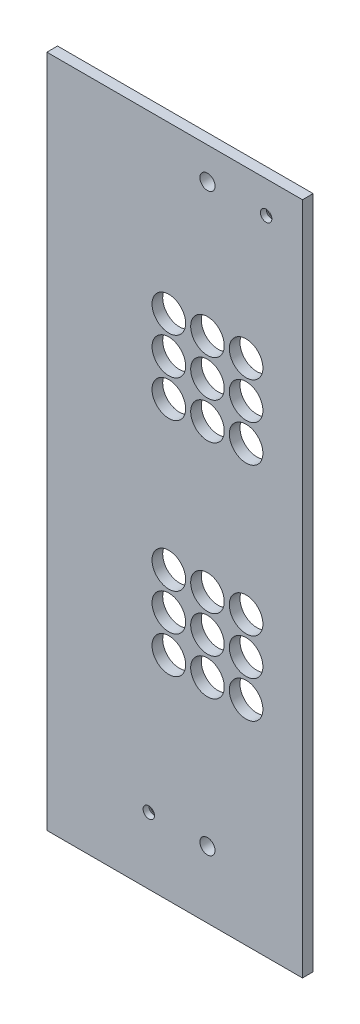
ISO-10303-21;
HEADER;
FILE_DESCRIPTION(('STEP AP214'),'2;1');
FILE_NAME('part.step','',(''),(''),'','','');
FILE_SCHEMA(('AUTOMOTIVE_DESIGN { 1 0 10303 214 1 1 1 1 }'));
ENDSEC;
DATA;
#1=APPLICATION_CONTEXT('core data for automotive mechanical design processes');
#2=APPLICATION_PROTOCOL_DEFINITION('international standard','automotive_design',2000,#1);
#3=PRODUCT_CONTEXT('',#1,'mechanical');
#4=PRODUCT('Part','Part','',(#3));
#5=PRODUCT_RELATED_PRODUCT_CATEGORY('part','',(#4));
#6=PRODUCT_DEFINITION_FORMATION('','',#4);
#7=PRODUCT_DEFINITION_CONTEXT('part definition',#1,'design');
#8=PRODUCT_DEFINITION('design','',#6,#7);
#9=PRODUCT_DEFINITION_SHAPE('','',#8);
#10=(LENGTH_UNIT() NAMED_UNIT(*) SI_UNIT(.MILLI.,.METRE.));
#11=(NAMED_UNIT(*) PLANE_ANGLE_UNIT() SI_UNIT($,.RADIAN.));
#12=(NAMED_UNIT(*) SI_UNIT($,.STERADIAN.) SOLID_ANGLE_UNIT());
#13=UNCERTAINTY_MEASURE_WITH_UNIT(LENGTH_MEASURE(1.E-05),#10,'distance_accuracy_value','');
#14=(GEOMETRIC_REPRESENTATION_CONTEXT(3) GLOBAL_UNCERTAINTY_ASSIGNED_CONTEXT((#13)) GLOBAL_UNIT_ASSIGNED_CONTEXT((#10,
#11,#12)) REPRESENTATION_CONTEXT('',''));
#15=CARTESIAN_POINT('',(0.,0.,0.));
#16=DIRECTION('',(0.,0.,1.));
#17=DIRECTION('',(1.,0.,0.));
#18=AXIS2_PLACEMENT_3D('',#15,#16,#17);
#19=CARTESIAN_POINT('',(0.,0.,3.175));
#20=DIRECTION('',(0.,0.,1.));
#21=DIRECTION('',(1.,0.,0.));
#22=AXIS2_PLACEMENT_3D('',#19,#20,#21);
#23=PLANE('',#22);
#24=DIRECTION('',(0.,1.,0.));
#25=VECTOR('',#24,1.);
#26=CARTESIAN_POINT('',(28.275,98.7125,3.175));
#27=LINE('',#26,#25);
#28=CARTESIAN_POINT('',(28.275,-98.7125,3.175));
#29=VERTEX_POINT('',#28);
#30=CARTESIAN_POINT('',(28.275,101.8875,3.175));
#31=VERTEX_POINT('',#30);
#32=EDGE_CURVE('E221',#29,#31,#27,.T.);
#33=ORIENTED_EDGE('',*,*,#32,.T.);
#34=DIRECTION('',(1.,0.,0.));
#35=VECTOR('',#34,1.);
#36=CARTESIAN_POINT('',(-47.8,101.8875,3.175));
#37=LINE('',#36,#35);
#38=CARTESIAN_POINT('',(-47.8,101.8875,3.175));
#39=VERTEX_POINT('',#38);
#40=EDGE_CURVE('E98',#39,#31,#37,.T.);
#41=ORIENTED_EDGE('',*,*,#40,.F.);
#42=DIRECTION('',(0.,1.,0.));
#43=VECTOR('',#42,1.);
#44=CARTESIAN_POINT('',(-47.8,-98.7125,3.175));
#45=LINE('',#44,#43);
#46=CARTESIAN_POINT('',(-47.8,-98.7125,3.175));
#47=VERTEX_POINT('',#46);
#48=EDGE_CURVE('E112',#47,#39,#45,.T.);
#49=ORIENTED_EDGE('',*,*,#48,.F.);
#50=DIRECTION('',(1.,0.,0.));
#51=VECTOR('',#50,1.);
#52=CARTESIAN_POINT('',(-28.275,-98.7125,3.175));
#53=LINE('',#52,#51);
#54=EDGE_CURVE('E49',#47,#29,#53,.T.);
#55=ORIENTED_EDGE('',*,*,#54,.T.);
#56=EDGE_LOOP('',(#33,#41,#49,#55));
#57=FACE_BOUND('',#56,.T.);
#58=CARTESIAN_POINT('',(-11.5,-35.3691628391525,3.175));
#59=DIRECTION('',(0.,0.,-1.));
#60=DIRECTION('',(-1.,0.,0.));
#61=AXIS2_PLACEMENT_3D('',#58,#59,#60);
#62=CIRCLE('',#61,4.9999999999989);
#63=CARTESIAN_POINT('',(-16.4999999999989,-35.3691628391525,3.175));
#64=VERTEX_POINT('',#63);
#65=EDGE_CURVE('E83',#64,#64,#62,.T.);
#66=ORIENTED_EDGE('',*,*,#65,.T.);
#67=EDGE_LOOP('',(#66));
#68=FACE_BOUND('',#67,.T.);
#69=CARTESIAN_POINT('',(11.5,-35.3691628391525,3.175));
#70=DIRECTION('',(0.,0.,-1.));
#71=DIRECTION('',(-1.,0.,0.));
#72=AXIS2_PLACEMENT_3D('',#69,#70,#71);
#73=CIRCLE('',#72,4.9999999999989);
#74=CARTESIAN_POINT('',(6.50000000000108,-35.3691628391525,3.175));
#75=VERTEX_POINT('',#74);
#76=EDGE_CURVE('E114',#75,#75,#73,.T.);
#77=ORIENTED_EDGE('',*,*,#76,.T.);
#78=EDGE_LOOP('',(#77));
#79=FACE_BOUND('',#78,.T.);
#80=CARTESIAN_POINT('',(11.5,-24.3691628391524,3.175));
#81=DIRECTION('',(0.,0.,-1.));
#82=DIRECTION('',(-1.,0.,0.));
#83=AXIS2_PLACEMENT_3D('',#80,#81,#82);
#84=CIRCLE('',#83,4.9999999999989);
#85=CARTESIAN_POINT('',(6.50000000000108,-24.3691628391524,3.175));
#86=VERTEX_POINT('',#85);
#87=EDGE_CURVE('E179',#86,#86,#84,.T.);
#88=ORIENTED_EDGE('',*,*,#87,.T.);
#89=EDGE_LOOP('',(#88));
#90=FACE_BOUND('',#89,.T.);
#91=CARTESIAN_POINT('',(0.,-24.3691628391524,3.175));
#92=DIRECTION('',(0.,0.,-1.));
#93=DIRECTION('',(-1.,0.,0.));
#94=AXIS2_PLACEMENT_3D('',#91,#92,#93);
#95=CIRCLE('',#94,4.9999999999989);
#96=CARTESIAN_POINT('',(-4.99999999999892,-24.3691628391524,3.175));
#97=VERTEX_POINT('',#96);
#98=EDGE_CURVE('E173',#97,#97,#95,.T.);
#99=ORIENTED_EDGE('',*,*,#98,.T.);
#100=EDGE_LOOP('',(#99));
#101=FACE_BOUND('',#100,.T.);
#102=CARTESIAN_POINT('',(-11.5,-24.3691628391524,3.175));
#103=DIRECTION('',(0.,0.,-1.));
#104=DIRECTION('',(-1.,0.,0.));
#105=AXIS2_PLACEMENT_3D('',#102,#103,#104);
#106=CIRCLE('',#105,4.9999999999989);
#107=CARTESIAN_POINT('',(-16.4999999999989,-24.3691628391524,3.175));
#108=VERTEX_POINT('',#107);
#109=EDGE_CURVE('E172',#108,#108,#106,.T.);
#110=ORIENTED_EDGE('',*,*,#109,.T.);
#111=EDGE_LOOP('',(#110));
#112=FACE_BOUND('',#111,.T.);
#113=CARTESIAN_POINT('',(0.,-35.3691628391525,3.175));
#114=DIRECTION('',(0.,0.,-1.));
#115=DIRECTION('',(-1.,0.,0.));
#116=AXIS2_PLACEMENT_3D('',#113,#114,#115);
#117=CIRCLE('',#116,4.9999999999989);
#118=CARTESIAN_POINT('',(-4.99999999999892,-35.3691628391525,3.175));
#119=VERTEX_POINT('',#118);
#120=EDGE_CURVE('E187',#119,#119,#117,.T.);
#121=ORIENTED_EDGE('',*,*,#120,.T.);
#122=EDGE_LOOP('',(#121));
#123=FACE_BOUND('',#122,.T.);
#124=CARTESIAN_POINT('',(-11.5,30.6308371608476,3.175));
#125=DIRECTION('',(0.,0.,-1.));
#126=DIRECTION('',(-1.,0.,0.));
#127=AXIS2_PLACEMENT_3D('',#124,#125,#126);
#128=CIRCLE('',#127,4.9999999999989);
#129=CARTESIAN_POINT('',(-16.4999999999989,30.6308371608476,3.175));
#130=VERTEX_POINT('',#129);
#131=EDGE_CURVE('E148',#130,#130,#128,.T.);
#132=ORIENTED_EDGE('',*,*,#131,.T.);
#133=EDGE_LOOP('',(#132));
#134=FACE_BOUND('',#133,.T.);
#135=CARTESIAN_POINT('',(11.5,-13.3691628391524,3.175));
#136=DIRECTION('',(0.,0.,-1.));
#137=DIRECTION('',(-1.,0.,0.));
#138=AXIS2_PLACEMENT_3D('',#135,#136,#137);
#139=CIRCLE('',#138,4.9999999999989);
#140=CARTESIAN_POINT('',(6.50000000000108,-13.3691628391524,3.175));
#141=VERTEX_POINT('',#140);
#142=EDGE_CURVE('E199',#141,#141,#139,.T.);
#143=ORIENTED_EDGE('',*,*,#142,.T.);
#144=EDGE_LOOP('',(#143));
#145=FACE_BOUND('',#144,.T.);
#146=CARTESIAN_POINT('',(0.,-13.3691628391524,3.175));
#147=DIRECTION('',(0.,0.,-1.));
#148=DIRECTION('',(-1.,0.,0.));
#149=AXIS2_PLACEMENT_3D('',#146,#147,#148);
#150=CIRCLE('',#149,4.9999999999989);
#151=CARTESIAN_POINT('',(-4.99999999999892,-13.3691628391524,3.175));
#152=VERTEX_POINT('',#151);
#153=EDGE_CURVE('E198',#152,#152,#150,.T.);
#154=ORIENTED_EDGE('',*,*,#153,.T.);
#155=EDGE_LOOP('',(#154));
#156=FACE_BOUND('',#155,.T.);
#157=CARTESIAN_POINT('',(-11.5,-13.3691628391524,3.175));
#158=DIRECTION('',(0.,0.,-1.));
#159=DIRECTION('',(-1.,0.,0.));
#160=AXIS2_PLACEMENT_3D('',#157,#158,#159);
#161=CIRCLE('',#160,4.9999999999989);
#162=CARTESIAN_POINT('',(-16.4999999999989,-13.3691628391524,3.175));
#163=VERTEX_POINT('',#162);
#164=EDGE_CURVE('E209',#163,#163,#161,.T.);
#165=ORIENTED_EDGE('',*,*,#164,.T.);
#166=EDGE_LOOP('',(#165));
#167=FACE_BOUND('',#166,.T.);
#168=CARTESIAN_POINT('',(11.5,41.6308371608475,3.175));
#169=DIRECTION('',(0.,0.,-1.));
#170=DIRECTION('',(-1.,0.,0.));
#171=AXIS2_PLACEMENT_3D('',#168,#169,#170);
#172=CIRCLE('',#171,4.9999999999989);
#173=CARTESIAN_POINT('',(6.50000000000107,41.6308371608475,3.175));
#174=VERTEX_POINT('',#173);
#175=EDGE_CURVE('E137',#174,#174,#172,.T.);
#176=ORIENTED_EDGE('',*,*,#175,.T.);
#177=EDGE_LOOP('',(#176));
#178=FACE_BOUND('',#177,.T.);
#179=CARTESIAN_POINT('',(-11.5,52.6308371608475,3.175));
#180=DIRECTION('',(0.,0.,-1.));
#181=DIRECTION('',(-1.,0.,0.));
#182=AXIS2_PLACEMENT_3D('',#179,#180,#181);
#183=CIRCLE('',#182,4.9999999999989);
#184=CARTESIAN_POINT('',(-16.4999999999989,52.6308371608475,3.175));
#185=VERTEX_POINT('',#184);
#186=EDGE_CURVE('E124',#185,#185,#183,.T.);
#187=ORIENTED_EDGE('',*,*,#186,.T.);
#188=EDGE_LOOP('',(#187));
#189=FACE_BOUND('',#188,.T.);
#190=CARTESIAN_POINT('',(0.,52.6308371608475,3.175));
#191=DIRECTION('',(0.,0.,-1.));
#192=DIRECTION('',(-1.,0.,0.));
#193=AXIS2_PLACEMENT_3D('',#190,#191,#192);
#194=CIRCLE('',#193,4.9999999999989);
#195=CARTESIAN_POINT('',(-4.99999999999893,52.6308371608475,3.175));
#196=VERTEX_POINT('',#195);
#197=EDGE_CURVE('E125',#196,#196,#194,.T.);
#198=ORIENTED_EDGE('',*,*,#197,.T.);
#199=EDGE_LOOP('',(#198));
#200=FACE_BOUND('',#199,.T.);
#201=CARTESIAN_POINT('',(11.5,52.6308371608475,3.175));
#202=DIRECTION('',(0.,0.,-1.));
#203=DIRECTION('',(-1.,0.,0.));
#204=AXIS2_PLACEMENT_3D('',#201,#202,#203);
#205=CIRCLE('',#204,4.9999999999989);
#206=CARTESIAN_POINT('',(6.50000000000107,52.6308371608475,3.175));
#207=VERTEX_POINT('',#206);
#208=EDGE_CURVE('E118',#207,#207,#205,.T.);
#209=ORIENTED_EDGE('',*,*,#208,.T.);
#210=EDGE_LOOP('',(#209));
#211=FACE_BOUND('',#210,.T.);
#212=CARTESIAN_POINT('',(0.,41.6308371608475,3.175));
#213=DIRECTION('',(0.,0.,-1.));
#214=DIRECTION('',(-1.,0.,0.));
#215=AXIS2_PLACEMENT_3D('',#212,#213,#214);
#216=CIRCLE('',#215,4.9999999999989);
#217=CARTESIAN_POINT('',(-4.99999999999893,41.6308371608475,3.175));
#218=VERTEX_POINT('',#217);
#219=EDGE_CURVE('E136',#218,#218,#216,.T.);
#220=ORIENTED_EDGE('',*,*,#219,.T.);
#221=EDGE_LOOP('',(#220));
#222=FACE_BOUND('',#221,.T.);
#223=CARTESIAN_POINT('',(-11.5,41.6308371608475,3.175));
#224=DIRECTION('',(0.,0.,-1.));
#225=DIRECTION('',(-1.,0.,0.));
#226=AXIS2_PLACEMENT_3D('',#223,#224,#225);
#227=CIRCLE('',#226,4.9999999999989);
#228=CARTESIAN_POINT('',(-16.4999999999989,41.6308371608475,3.175));
#229=VERTEX_POINT('',#228);
#230=EDGE_CURVE('E161',#229,#229,#227,.T.);
#231=ORIENTED_EDGE('',*,*,#230,.T.);
#232=EDGE_LOOP('',(#231));
#233=FACE_BOUND('',#232,.T.);
#234=CARTESIAN_POINT('',(11.5,30.6308371608476,3.175));
#235=DIRECTION('',(0.,0.,-1.));
#236=DIRECTION('',(-1.,0.,0.));
#237=AXIS2_PLACEMENT_3D('',#234,#235,#236);
#238=CIRCLE('',#237,4.9999999999989);
#239=CARTESIAN_POINT('',(6.50000000000107,30.6308371608476,3.175));
#240=VERTEX_POINT('',#239);
#241=EDGE_CURVE('E155',#240,#240,#238,.T.);
#242=ORIENTED_EDGE('',*,*,#241,.T.);
#243=EDGE_LOOP('',(#242));
#244=FACE_BOUND('',#243,.T.);
#245=CARTESIAN_POINT('',(0.,30.6308371608476,3.175));
#246=DIRECTION('',(0.,0.,-1.));
#247=DIRECTION('',(-1.,0.,0.));
#248=AXIS2_PLACEMENT_3D('',#245,#246,#247);
#249=CIRCLE('',#248,4.9999999999989);
#250=CARTESIAN_POINT('',(-4.99999999999893,30.6308371608476,3.175));
#251=VERTEX_POINT('',#250);
#252=EDGE_CURVE('E149',#251,#251,#249,.T.);
#253=ORIENTED_EDGE('',*,*,#252,.T.);
#254=EDGE_LOOP('',(#253));
#255=FACE_BOUND('',#254,.T.);
#256=CARTESIAN_POINT('',(8.53483950180589E-13,-78.8874998999983,3.175));
#257=DIRECTION('',(0.,0.,1.));
#258=DIRECTION('',(1.,0.,0.));
#259=AXIS2_PLACEMENT_3D('',#256,#257,#258);
#260=CIRCLE('',#259,2.25);
#261=CARTESIAN_POINT('',(2.25000000000085,-78.8874998999983,3.175));
#262=VERTEX_POINT('',#261);
#263=EDGE_CURVE('E102',#262,#262,#260,.T.);
#264=ORIENTED_EDGE('',*,*,#263,.F.);
#265=EDGE_LOOP('',(#264));
#266=FACE_BOUND('',#265,.T.);
#267=CARTESIAN_POINT('',(-1.13103970633688E-12,92.3625001000009,3.175));
#268=DIRECTION('',(0.,0.,1.));
#269=DIRECTION('',(1.,0.,0.));
#270=AXIS2_PLACEMENT_3D('',#267,#268,#269);
#271=CIRCLE('',#270,2.25);
#272=CARTESIAN_POINT('',(2.24999999999887,92.3625001000009,3.175));
#273=VERTEX_POINT('',#272);
#274=EDGE_CURVE('E273',#273,#273,#271,.T.);
#275=ORIENTED_EDGE('',*,*,#274,.F.);
#276=EDGE_LOOP('',(#275));
#277=FACE_BOUND('',#276,.T.);
#278=CARTESIAN_POINT('',(17.4625,92.3625000999999,3.175));
#279=DIRECTION('',(0.,0.,-1.));
#280=DIRECTION('',(-1.,0.,0.));
#281=AXIS2_PLACEMENT_3D('',#278,#279,#280);
#282=CIRCLE('',#281,1.7);
#283=CARTESIAN_POINT('',(15.7625,92.3625000999999,3.175));
#284=VERTEX_POINT('',#283);
#285=EDGE_CURVE('E277',#284,#284,#282,.T.);
#286=ORIENTED_EDGE('',*,*,#285,.T.);
#287=EDGE_LOOP('',(#286));
#288=FACE_BOUND('',#287,.T.);
#289=CARTESIAN_POINT('',(-17.4625000000001,-78.8874999000001,3.175));
#290=DIRECTION('',(0.,0.,-1.));
#291=DIRECTION('',(-1.,0.,0.));
#292=AXIS2_PLACEMENT_3D('',#289,#290,#291);
#293=CIRCLE('',#292,1.7);
#294=CARTESIAN_POINT('',(-19.1625000000001,-78.8874999000001,3.175));
#295=VERTEX_POINT('',#294);
#296=EDGE_CURVE('E280',#295,#295,#293,.T.);
#297=ORIENTED_EDGE('',*,*,#296,.T.);
#298=EDGE_LOOP('',(#297));
#299=FACE_BOUND('',#298,.T.);
#300=ADVANCED_FACE('F40',(#57,#68,#79,#90,#101,#112,#123,#134,#145,#156,#167,#178,#189,#200,
#211,#222,#233,#244,#255,#266,#277,#288,#299),#23,.T.);
#301=CARTESIAN_POINT('',(28.275,98.7125,3.175));
#302=DIRECTION('',(-1.,0.,0.));
#303=DIRECTION('',(0.,-1.,0.));
#304=AXIS2_PLACEMENT_3D('',#301,#302,#303);
#305=PLANE('',#304);
#306=DIRECTION('',(0.,1.,0.));
#307=VECTOR('',#306,1.);
#308=CARTESIAN_POINT('',(28.275,98.7125,0.));
#309=LINE('',#308,#307);
#310=CARTESIAN_POINT('',(28.275,-98.7125,0.));
#311=VERTEX_POINT('',#310);
#312=CARTESIAN_POINT('',(28.275,101.8875,0.));
#313=VERTEX_POINT('',#312);
#314=EDGE_CURVE('E76',#311,#313,#309,.T.);
#315=ORIENTED_EDGE('',*,*,#314,.T.);
#316=DIRECTION('',(0.,0.,-1.));
#317=VECTOR('',#316,1.);
#318=CARTESIAN_POINT('',(28.275,101.8875,3.175));
#319=LINE('',#318,#317);
#320=EDGE_CURVE('E80',#31,#313,#319,.T.);
#321=ORIENTED_EDGE('',*,*,#320,.F.);
#322=ORIENTED_EDGE('',*,*,#32,.F.);
#323=DIRECTION('',(0.,0.,-1.));
#324=VECTOR('',#323,1.);
#325=CARTESIAN_POINT('',(28.275,-98.7125,3.175));
#326=LINE('',#325,#324);
#327=EDGE_CURVE('E11',#29,#311,#326,.T.);
#328=ORIENTED_EDGE('',*,*,#327,.T.);
#329=EDGE_LOOP('',(#315,#321,#322,#328));
#330=FACE_BOUND('',#329,.T.);
#331=ADVANCED_FACE('F42',(#330),#305,.F.);
#332=CARTESIAN_POINT('',(-28.275,-98.7125,3.175));
#333=DIRECTION('',(0.,1.,0.));
#334=DIRECTION('',(0.,0.,1.));
#335=AXIS2_PLACEMENT_3D('',#332,#333,#334);
#336=PLANE('',#335);
#337=DIRECTION('',(1.,0.,0.));
#338=VECTOR('',#337,1.);
#339=CARTESIAN_POINT('',(-28.275,-98.7125,0.));
#340=LINE('',#339,#338);
#341=CARTESIAN_POINT('',(-47.8,-98.7125,0.));
#342=VERTEX_POINT('',#341);
#343=EDGE_CURVE('E82',#342,#311,#340,.T.);
#344=ORIENTED_EDGE('',*,*,#343,.T.);
#345=ORIENTED_EDGE('',*,*,#327,.F.);
#346=ORIENTED_EDGE('',*,*,#54,.F.);
#347=DIRECTION('',(0.,0.,1.));
#348=VECTOR('',#347,1.);
#349=CARTESIAN_POINT('',(-47.8,-98.7125,0.));
#350=LINE('',#349,#348);
#351=EDGE_CURVE('E109',#342,#47,#350,.T.);
#352=ORIENTED_EDGE('',*,*,#351,.F.);
#353=EDGE_LOOP('',(#344,#345,#346,#352));
#354=FACE_BOUND('',#353,.T.);
#355=ADVANCED_FACE('F225',(#354),#336,.F.);
#356=CARTESIAN_POINT('',(0.,0.,0.));
#357=DIRECTION('',(0.,0.,1.));
#358=DIRECTION('',(1.,0.,0.));
#359=AXIS2_PLACEMENT_3D('',#356,#357,#358);
#360=PLANE('',#359);
#361=CARTESIAN_POINT('',(-17.4625000000001,-78.8874999000001,0.));
#362=DIRECTION('',(0.,0.,-1.));
#363=DIRECTION('',(-1.,0.,0.));
#364=AXIS2_PLACEMENT_3D('',#361,#362,#363);
#365=CIRCLE('',#364,3.15);
#366=CARTESIAN_POINT('',(-20.6125000000001,-78.8874999000001,0.));
#367=VERTEX_POINT('',#366);
#368=EDGE_CURVE('E289',#367,#367,#365,.T.);
#369=ORIENTED_EDGE('',*,*,#368,.F.);
#370=EDGE_LOOP('',(#369));
#371=FACE_BOUND('',#370,.T.);
#372=CARTESIAN_POINT('',(17.4625,92.3625000999999,0.));
#373=DIRECTION('',(0.,0.,-1.));
#374=DIRECTION('',(-1.,0.,0.));
#375=AXIS2_PLACEMENT_3D('',#372,#373,#374);
#376=CIRCLE('',#375,3.15);
#377=CARTESIAN_POINT('',(14.3125,92.3625000999999,0.));
#378=VERTEX_POINT('',#377);
#379=EDGE_CURVE('E282',#378,#378,#376,.T.);
#380=ORIENTED_EDGE('',*,*,#379,.F.);
#381=EDGE_LOOP('',(#380));
#382=FACE_BOUND('',#381,.T.);
#383=CARTESIAN_POINT('',(-1.13103970633688E-12,92.3625001000009,0.));
#384=DIRECTION('',(0.,0.,1.));
#385=DIRECTION('',(1.,0.,0.));
#386=AXIS2_PLACEMENT_3D('',#383,#384,#385);
#387=CIRCLE('',#386,2.25);
#388=CARTESIAN_POINT('',(2.24999999999887,92.3625001000009,0.));
#389=VERTEX_POINT('',#388);
#390=EDGE_CURVE('E297',#389,#389,#387,.T.);
#391=ORIENTED_EDGE('',*,*,#390,.T.);
#392=EDGE_LOOP('',(#391));
#393=FACE_BOUND('',#392,.T.);
#394=CARTESIAN_POINT('',(8.53483950180589E-13,-78.8874998999983,0.));
#395=DIRECTION('',(0.,0.,1.));
#396=DIRECTION('',(1.,0.,0.));
#397=AXIS2_PLACEMENT_3D('',#394,#395,#396);
#398=CIRCLE('',#397,2.25);
#399=CARTESIAN_POINT('',(2.25000000000085,-78.8874998999983,0.));
#400=VERTEX_POINT('',#399);
#401=EDGE_CURVE('E99',#400,#400,#398,.T.);
#402=ORIENTED_EDGE('',*,*,#401,.T.);
#403=EDGE_LOOP('',(#402));
#404=FACE_BOUND('',#403,.T.);
#405=CARTESIAN_POINT('',(0.,30.6308371608476,0.));
#406=DIRECTION('',(0.,0.,-1.));
#407=DIRECTION('',(-1.,0.,0.));
#408=AXIS2_PLACEMENT_3D('',#405,#406,#407);
#409=CIRCLE('',#408,4.9999999999989);
#410=CARTESIAN_POINT('',(-4.99999999999893,30.6308371608476,0.));
#411=VERTEX_POINT('',#410);
#412=EDGE_CURVE('E145',#411,#411,#409,.T.);
#413=ORIENTED_EDGE('',*,*,#412,.F.);
#414=EDGE_LOOP('',(#413));
#415=FACE_BOUND('',#414,.T.);
#416=CARTESIAN_POINT('',(11.5,30.6308371608476,0.));
#417=DIRECTION('',(0.,0.,-1.));
#418=DIRECTION('',(-1.,0.,0.));
#419=AXIS2_PLACEMENT_3D('',#416,#417,#418);
#420=CIRCLE('',#419,4.9999999999989);
#421=CARTESIAN_POINT('',(6.50000000000107,30.6308371608476,0.));
#422=VERTEX_POINT('',#421);
#423=EDGE_CURVE('E152',#422,#422,#420,.T.);
#424=ORIENTED_EDGE('',*,*,#423,.F.);
#425=EDGE_LOOP('',(#424));
#426=FACE_BOUND('',#425,.T.);
#427=CARTESIAN_POINT('',(-11.5,41.6308371608475,0.));
#428=DIRECTION('',(0.,0.,-1.));
#429=DIRECTION('',(-1.,0.,0.));
#430=AXIS2_PLACEMENT_3D('',#427,#428,#429);
#431=CIRCLE('',#430,4.9999999999989);
#432=CARTESIAN_POINT('',(-16.4999999999989,41.6308371608475,0.));
#433=VERTEX_POINT('',#432);
#434=EDGE_CURVE('E158',#433,#433,#431,.T.);
#435=ORIENTED_EDGE('',*,*,#434,.F.);
#436=EDGE_LOOP('',(#435));
#437=FACE_BOUND('',#436,.T.);
#438=CARTESIAN_POINT('',(0.,41.6308371608475,0.));
#439=DIRECTION('',(0.,0.,-1.));
#440=DIRECTION('',(-1.,0.,0.));
#441=AXIS2_PLACEMENT_3D('',#438,#439,#440);
#442=CIRCLE('',#441,4.9999999999989);
#443=CARTESIAN_POINT('',(-4.99999999999893,41.6308371608475,0.));
#444=VERTEX_POINT('',#443);
#445=EDGE_CURVE('E164',#444,#444,#442,.T.);
#446=ORIENTED_EDGE('',*,*,#445,.F.);
#447=EDGE_LOOP('',(#446));
#448=FACE_BOUND('',#447,.T.);
#449=CARTESIAN_POINT('',(11.5,52.6308371608475,0.));
#450=DIRECTION('',(0.,0.,-1.));
#451=DIRECTION('',(-1.,0.,0.));
#452=AXIS2_PLACEMENT_3D('',#449,#450,#451);
#453=CIRCLE('',#452,4.9999999999989);
#454=CARTESIAN_POINT('',(6.50000000000107,52.6308371608475,0.));
#455=VERTEX_POINT('',#454);
#456=EDGE_CURVE('E128',#455,#455,#453,.T.);
#457=ORIENTED_EDGE('',*,*,#456,.F.);
#458=EDGE_LOOP('',(#457));
#459=FACE_BOUND('',#458,.T.);
#460=CARTESIAN_POINT('',(0.,52.6308371608475,0.));
#461=DIRECTION('',(0.,0.,-1.));
#462=DIRECTION('',(-1.,0.,0.));
#463=AXIS2_PLACEMENT_3D('',#460,#461,#462);
#464=CIRCLE('',#463,4.9999999999989);
#465=CARTESIAN_POINT('',(-4.99999999999893,52.6308371608475,0.));
#466=VERTEX_POINT('',#465);
#467=EDGE_CURVE('E121',#466,#466,#464,.T.);
#468=ORIENTED_EDGE('',*,*,#467,.F.);
#469=EDGE_LOOP('',(#468));
#470=FACE_BOUND('',#469,.T.);
#471=CARTESIAN_POINT('',(-11.5,52.6308371608475,0.));
#472=DIRECTION('',(0.,0.,-1.));
#473=DIRECTION('',(-1.,0.,0.));
#474=AXIS2_PLACEMENT_3D('',#471,#472,#473);
#475=CIRCLE('',#474,4.9999999999989);
#476=CARTESIAN_POINT('',(-16.4999999999989,52.6308371608475,0.));
#477=VERTEX_POINT('',#476);
#478=EDGE_CURVE('E140',#477,#477,#475,.T.);
#479=ORIENTED_EDGE('',*,*,#478,.F.);
#480=EDGE_LOOP('',(#479));
#481=FACE_BOUND('',#480,.T.);
#482=CARTESIAN_POINT('',(11.5,41.6308371608475,0.));
#483=DIRECTION('',(0.,0.,-1.));
#484=DIRECTION('',(-1.,0.,0.));
#485=AXIS2_PLACEMENT_3D('',#482,#483,#484);
#486=CIRCLE('',#485,4.9999999999989);
#487=CARTESIAN_POINT('',(6.50000000000107,41.6308371608475,0.));
#488=VERTEX_POINT('',#487);
#489=EDGE_CURVE('E133',#488,#488,#486,.T.);
#490=ORIENTED_EDGE('',*,*,#489,.F.);
#491=EDGE_LOOP('',(#490));
#492=FACE_BOUND('',#491,.T.);
#493=CARTESIAN_POINT('',(-11.5,-13.3691628391524,0.));
#494=DIRECTION('',(0.,0.,-1.));
#495=DIRECTION('',(-1.,0.,0.));
#496=AXIS2_PLACEMENT_3D('',#493,#494,#495);
#497=CIRCLE('',#496,4.9999999999989);
#498=CARTESIAN_POINT('',(-16.4999999999989,-13.3691628391524,0.));
#499=VERTEX_POINT('',#498);
#500=EDGE_CURVE('E182',#499,#499,#497,.T.);
#501=ORIENTED_EDGE('',*,*,#500,.F.);
#502=EDGE_LOOP('',(#501));
#503=FACE_BOUND('',#502,.T.);
#504=CARTESIAN_POINT('',(0.,-13.3691628391524,0.));
#505=DIRECTION('',(0.,0.,-1.));
#506=DIRECTION('',(-1.,0.,0.));
#507=AXIS2_PLACEMENT_3D('',#504,#505,#506);
#508=CIRCLE('',#507,4.9999999999989);
#509=CARTESIAN_POINT('',(-4.99999999999892,-13.3691628391524,0.));
#510=VERTEX_POINT('',#509);
#511=EDGE_CURVE('E212',#510,#510,#508,.T.);
#512=ORIENTED_EDGE('',*,*,#511,.F.);
#513=EDGE_LOOP('',(#512));
#514=FACE_BOUND('',#513,.T.);
#515=CARTESIAN_POINT('',(11.5,-13.3691628391524,0.));
#516=DIRECTION('',(0.,0.,-1.));
#517=DIRECTION('',(-1.,0.,0.));
#518=AXIS2_PLACEMENT_3D('',#515,#516,#517);
#519=CIRCLE('',#518,4.9999999999989);
#520=CARTESIAN_POINT('',(6.50000000000108,-13.3691628391524,0.));
#521=VERTEX_POINT('',#520);
#522=EDGE_CURVE('E195',#521,#521,#519,.T.);
#523=ORIENTED_EDGE('',*,*,#522,.F.);
#524=EDGE_LOOP('',(#523));
#525=FACE_BOUND('',#524,.T.);
#526=CARTESIAN_POINT('',(-11.5,30.6308371608476,0.));
#527=DIRECTION('',(0.,0.,-1.));
#528=DIRECTION('',(-1.,0.,0.));
#529=AXIS2_PLACEMENT_3D('',#526,#527,#528);
#530=CIRCLE('',#529,4.9999999999989);
#531=CARTESIAN_POINT('',(-16.4999999999989,30.6308371608476,0.));
#532=VERTEX_POINT('',#531);
#533=EDGE_CURVE('E202',#532,#532,#530,.T.);
#534=ORIENTED_EDGE('',*,*,#533,.F.);
#535=EDGE_LOOP('',(#534));
#536=FACE_BOUND('',#535,.T.);
#537=CARTESIAN_POINT('',(0.,-35.3691628391525,0.));
#538=DIRECTION('',(0.,0.,-1.));
#539=DIRECTION('',(-1.,0.,0.));
#540=AXIS2_PLACEMENT_3D('',#537,#538,#539);
#541=CIRCLE('',#540,4.9999999999989);
#542=CARTESIAN_POINT('',(-4.99999999999892,-35.3691628391525,0.));
#543=VERTEX_POINT('',#542);
#544=EDGE_CURVE('E183',#543,#543,#541,.T.);
#545=ORIENTED_EDGE('',*,*,#544,.F.);
#546=EDGE_LOOP('',(#545));
#547=FACE_BOUND('',#546,.T.);
#548=CARTESIAN_POINT('',(-11.5,-24.3691628391524,0.));
#549=DIRECTION('',(0.,0.,-1.));
#550=DIRECTION('',(-1.,0.,0.));
#551=AXIS2_PLACEMENT_3D('',#548,#549,#550);
#552=CIRCLE('',#551,4.9999999999989);
#553=CARTESIAN_POINT('',(-16.4999999999989,-24.3691628391524,0.));
#554=VERTEX_POINT('',#553);
#555=EDGE_CURVE('E190',#554,#554,#552,.T.);
#556=ORIENTED_EDGE('',*,*,#555,.F.);
#557=EDGE_LOOP('',(#556));
#558=FACE_BOUND('',#557,.T.);
#559=CARTESIAN_POINT('',(0.,-24.3691628391524,0.));
#560=DIRECTION('',(0.,0.,-1.));
#561=DIRECTION('',(-1.,0.,0.));
#562=AXIS2_PLACEMENT_3D('',#559,#560,#561);
#563=CIRCLE('',#562,4.9999999999989);
#564=CARTESIAN_POINT('',(-4.99999999999892,-24.3691628391524,0.));
#565=VERTEX_POINT('',#564);
#566=EDGE_CURVE('E169',#565,#565,#563,.T.);
#567=ORIENTED_EDGE('',*,*,#566,.F.);
#568=EDGE_LOOP('',(#567));
#569=FACE_BOUND('',#568,.T.);
#570=CARTESIAN_POINT('',(11.5,-24.3691628391524,0.));
#571=DIRECTION('',(0.,0.,-1.));
#572=DIRECTION('',(-1.,0.,0.));
#573=AXIS2_PLACEMENT_3D('',#570,#571,#572);
#574=CIRCLE('',#573,4.9999999999989);
#575=CARTESIAN_POINT('',(6.50000000000108,-24.3691628391524,0.));
#576=VERTEX_POINT('',#575);
#577=EDGE_CURVE('E176',#576,#576,#574,.T.);
#578=ORIENTED_EDGE('',*,*,#577,.F.);
#579=EDGE_LOOP('',(#578));
#580=FACE_BOUND('',#579,.T.);
#581=CARTESIAN_POINT('',(11.5,-35.3691628391525,0.));
#582=DIRECTION('',(0.,0.,-1.));
#583=DIRECTION('',(-1.,0.,0.));
#584=AXIS2_PLACEMENT_3D('',#581,#582,#583);
#585=CIRCLE('',#584,4.9999999999989);
#586=CARTESIAN_POINT('',(6.50000000000108,-35.3691628391525,0.));
#587=VERTEX_POINT('',#586);
#588=EDGE_CURVE('E115',#587,#587,#585,.T.);
#589=ORIENTED_EDGE('',*,*,#588,.F.);
#590=EDGE_LOOP('',(#589));
#591=FACE_BOUND('',#590,.T.);
#592=CARTESIAN_POINT('',(-11.5,-35.3691628391525,0.));
#593=DIRECTION('',(0.,0.,-1.));
#594=DIRECTION('',(-1.,0.,0.));
#595=AXIS2_PLACEMENT_3D('',#592,#593,#594);
#596=CIRCLE('',#595,4.9999999999989);
#597=CARTESIAN_POINT('',(-16.4999999999989,-35.3691628391525,0.));
#598=VERTEX_POINT('',#597);
#599=EDGE_CURVE('E186',#598,#598,#596,.T.);
#600=ORIENTED_EDGE('',*,*,#599,.F.);
#601=EDGE_LOOP('',(#600));
#602=FACE_BOUND('',#601,.T.);
#603=ORIENTED_EDGE('',*,*,#314,.F.);
#604=ORIENTED_EDGE('',*,*,#343,.F.);
#605=DIRECTION('',(0.,-1.,0.));
#606=VECTOR('',#605,1.);
#607=CARTESIAN_POINT('',(-47.8,98.7125,0.));
#608=LINE('',#607,#606);
#609=CARTESIAN_POINT('',(-47.8,101.8875,0.));
#610=VERTEX_POINT('',#609);
#611=EDGE_CURVE('E89',#610,#342,#608,.T.);
#612=ORIENTED_EDGE('',*,*,#611,.F.);
#613=DIRECTION('',(-1.,0.,0.));
#614=VECTOR('',#613,1.);
#615=CARTESIAN_POINT('',(28.275,101.8875,0.));
#616=LINE('',#615,#614);
#617=EDGE_CURVE('E86',#313,#610,#616,.T.);
#618=ORIENTED_EDGE('',*,*,#617,.F.);
#619=EDGE_LOOP('',(#603,#604,#612,#618));
#620=FACE_BOUND('',#619,.T.);
#621=ADVANCED_FACE('F87',(#371,#382,#393,#404,#415,#426,#437,#448,#459,#470,#481,#492,#503,#514,
#525,#536,#547,#558,#569,#580,#591,#602,#620),#360,.F.);
#622=CARTESIAN_POINT('',(-11.5,-35.3691628391525,3.175));
#623=DIRECTION('',(0.,0.,-1.));
#624=DIRECTION('',(-1.,0.,0.));
#625=AXIS2_PLACEMENT_3D('',#622,#623,#624);
#626=CYLINDRICAL_SURFACE('',#625,4.9999999999989);
#627=ORIENTED_EDGE('',*,*,#65,.F.);
#628=EDGE_LOOP('',(#627));
#629=FACE_BOUND('',#628,.T.);
#630=ORIENTED_EDGE('',*,*,#599,.T.);
#631=EDGE_LOOP('',(#630));
#632=FACE_BOUND('',#631,.T.);
#633=ADVANCED_FACE('F323',(#629,#632),#626,.F.);
#634=CARTESIAN_POINT('',(11.5,-35.3691628391525,3.175));
#635=DIRECTION('',(0.,0.,-1.));
#636=DIRECTION('',(-1.,0.,0.));
#637=AXIS2_PLACEMENT_3D('',#634,#635,#636);
#638=CYLINDRICAL_SURFACE('',#637,4.9999999999989);
#639=ORIENTED_EDGE('',*,*,#76,.F.);
#640=EDGE_LOOP('',(#639));
#641=FACE_BOUND('',#640,.T.);
#642=ORIENTED_EDGE('',*,*,#588,.T.);
#643=EDGE_LOOP('',(#642));
#644=FACE_BOUND('',#643,.T.);
#645=ADVANCED_FACE('F319',(#641,#644),#638,.F.);
#646=CARTESIAN_POINT('',(11.5,-24.3691628391524,3.175));
#647=DIRECTION('',(0.,0.,-1.));
#648=DIRECTION('',(-1.,0.,0.));
#649=AXIS2_PLACEMENT_3D('',#646,#647,#648);
#650=CYLINDRICAL_SURFACE('',#649,4.9999999999989);
#651=ORIENTED_EDGE('',*,*,#87,.F.);
#652=EDGE_LOOP('',(#651));
#653=FACE_BOUND('',#652,.T.);
#654=ORIENTED_EDGE('',*,*,#577,.T.);
#655=EDGE_LOOP('',(#654));
#656=FACE_BOUND('',#655,.T.);
#657=ADVANCED_FACE('F322',(#653,#656),#650,.F.);
#658=CARTESIAN_POINT('',(0.,-24.3691628391524,3.175));
#659=DIRECTION('',(0.,0.,-1.));
#660=DIRECTION('',(-1.,0.,0.));
#661=AXIS2_PLACEMENT_3D('',#658,#659,#660);
#662=CYLINDRICAL_SURFACE('',#661,4.9999999999989);
#663=ORIENTED_EDGE('',*,*,#98,.F.);
#664=EDGE_LOOP('',(#663));
#665=FACE_BOUND('',#664,.T.);
#666=ORIENTED_EDGE('',*,*,#566,.T.);
#667=EDGE_LOOP('',(#666));
#668=FACE_BOUND('',#667,.T.);
#669=ADVANCED_FACE('F357',(#665,#668),#662,.F.);
#670=CARTESIAN_POINT('',(-11.5,-24.3691628391524,3.175));
#671=DIRECTION('',(0.,0.,-1.));
#672=DIRECTION('',(-1.,0.,0.));
#673=AXIS2_PLACEMENT_3D('',#670,#671,#672);
#674=CYLINDRICAL_SURFACE('',#673,4.9999999999989);
#675=ORIENTED_EDGE('',*,*,#109,.F.);
#676=EDGE_LOOP('',(#675));
#677=FACE_BOUND('',#676,.T.);
#678=ORIENTED_EDGE('',*,*,#555,.T.);
#679=EDGE_LOOP('',(#678));
#680=FACE_BOUND('',#679,.T.);
#681=ADVANCED_FACE('F360',(#677,#680),#674,.F.);
#682=CARTESIAN_POINT('',(0.,-35.3691628391525,3.175));
#683=DIRECTION('',(0.,0.,-1.));
#684=DIRECTION('',(-1.,0.,0.));
#685=AXIS2_PLACEMENT_3D('',#682,#683,#684);
#686=CYLINDRICAL_SURFACE('',#685,4.9999999999989);
#687=ORIENTED_EDGE('',*,*,#120,.F.);
#688=EDGE_LOOP('',(#687));
#689=FACE_BOUND('',#688,.T.);
#690=ORIENTED_EDGE('',*,*,#544,.T.);
#691=EDGE_LOOP('',(#690));
#692=FACE_BOUND('',#691,.T.);
#693=ADVANCED_FACE('F365',(#689,#692),#686,.F.);
#694=CARTESIAN_POINT('',(-11.5,30.6308371608476,3.175));
#695=DIRECTION('',(0.,0.,-1.));
#696=DIRECTION('',(-1.,0.,0.));
#697=AXIS2_PLACEMENT_3D('',#694,#695,#696);
#698=CYLINDRICAL_SURFACE('',#697,4.9999999999989);
#699=ORIENTED_EDGE('',*,*,#131,.F.);
#700=EDGE_LOOP('',(#699));
#701=FACE_BOUND('',#700,.T.);
#702=ORIENTED_EDGE('',*,*,#533,.T.);
#703=EDGE_LOOP('',(#702));
#704=FACE_BOUND('',#703,.T.);
#705=ADVANCED_FACE('F368',(#701,#704),#698,.F.);
#706=CARTESIAN_POINT('',(11.5,-13.3691628391524,3.175));
#707=DIRECTION('',(0.,0.,-1.));
#708=DIRECTION('',(-1.,0.,0.));
#709=AXIS2_PLACEMENT_3D('',#706,#707,#708);
#710=CYLINDRICAL_SURFACE('',#709,4.9999999999989);
#711=ORIENTED_EDGE('',*,*,#142,.F.);
#712=EDGE_LOOP('',(#711));
#713=FACE_BOUND('',#712,.T.);
#714=ORIENTED_EDGE('',*,*,#522,.T.);
#715=EDGE_LOOP('',(#714));
#716=FACE_BOUND('',#715,.T.);
#717=ADVANCED_FACE('F373',(#713,#716),#710,.F.);
#718=CARTESIAN_POINT('',(0.,-13.3691628391524,3.175));
#719=DIRECTION('',(0.,0.,-1.));
#720=DIRECTION('',(-1.,0.,0.));
#721=AXIS2_PLACEMENT_3D('',#718,#719,#720);
#722=CYLINDRICAL_SURFACE('',#721,4.9999999999989);
#723=ORIENTED_EDGE('',*,*,#153,.F.);
#724=EDGE_LOOP('',(#723));
#725=FACE_BOUND('',#724,.T.);
#726=ORIENTED_EDGE('',*,*,#511,.T.);
#727=EDGE_LOOP('',(#726));
#728=FACE_BOUND('',#727,.T.);
#729=ADVANCED_FACE('F376',(#725,#728),#722,.F.);
#730=CARTESIAN_POINT('',(-11.5,-13.3691628391524,3.175));
#731=DIRECTION('',(0.,0.,-1.));
#732=DIRECTION('',(-1.,0.,0.));
#733=AXIS2_PLACEMENT_3D('',#730,#731,#732);
#734=CYLINDRICAL_SURFACE('',#733,4.9999999999989);
#735=ORIENTED_EDGE('',*,*,#164,.F.);
#736=EDGE_LOOP('',(#735));
#737=FACE_BOUND('',#736,.T.);
#738=ORIENTED_EDGE('',*,*,#500,.T.);
#739=EDGE_LOOP('',(#738));
#740=FACE_BOUND('',#739,.T.);
#741=ADVANCED_FACE('F338',(#737,#740),#734,.F.);
#742=CARTESIAN_POINT('',(11.5,41.6308371608475,3.175));
#743=DIRECTION('',(0.,0.,-1.));
#744=DIRECTION('',(-1.,0.,0.));
#745=AXIS2_PLACEMENT_3D('',#742,#743,#744);
#746=CYLINDRICAL_SURFACE('',#745,4.9999999999989);
#747=ORIENTED_EDGE('',*,*,#175,.F.);
#748=EDGE_LOOP('',(#747));
#749=FACE_BOUND('',#748,.T.);
#750=ORIENTED_EDGE('',*,*,#489,.T.);
#751=EDGE_LOOP('',(#750));
#752=FACE_BOUND('',#751,.T.);
#753=ADVANCED_FACE('F335',(#749,#752),#746,.F.);
#754=CARTESIAN_POINT('',(-11.5,52.6308371608475,3.175));
#755=DIRECTION('',(0.,0.,-1.));
#756=DIRECTION('',(-1.,0.,0.));
#757=AXIS2_PLACEMENT_3D('',#754,#755,#756);
#758=CYLINDRICAL_SURFACE('',#757,4.9999999999989);
#759=ORIENTED_EDGE('',*,*,#186,.F.);
#760=EDGE_LOOP('',(#759));
#761=FACE_BOUND('',#760,.T.);
#762=ORIENTED_EDGE('',*,*,#478,.T.);
#763=EDGE_LOOP('',(#762));
#764=FACE_BOUND('',#763,.T.);
#765=ADVANCED_FACE('F329',(#761,#764),#758,.F.);
#766=CARTESIAN_POINT('',(0.,52.6308371608475,3.175));
#767=DIRECTION('',(0.,0.,-1.));
#768=DIRECTION('',(-1.,0.,0.));
#769=AXIS2_PLACEMENT_3D('',#766,#767,#768);
#770=CYLINDRICAL_SURFACE('',#769,4.9999999999989);
#771=ORIENTED_EDGE('',*,*,#197,.F.);
#772=EDGE_LOOP('',(#771));
#773=FACE_BOUND('',#772,.T.);
#774=ORIENTED_EDGE('',*,*,#467,.T.);
#775=EDGE_LOOP('',(#774));
#776=FACE_BOUND('',#775,.T.);
#777=ADVANCED_FACE('F325',(#773,#776),#770,.F.);
#778=CARTESIAN_POINT('',(11.5,52.6308371608475,3.175));
#779=DIRECTION('',(0.,0.,-1.));
#780=DIRECTION('',(-1.,0.,0.));
#781=AXIS2_PLACEMENT_3D('',#778,#779,#780);
#782=CYLINDRICAL_SURFACE('',#781,4.9999999999989);
#783=ORIENTED_EDGE('',*,*,#208,.F.);
#784=EDGE_LOOP('',(#783));
#785=FACE_BOUND('',#784,.T.);
#786=ORIENTED_EDGE('',*,*,#456,.T.);
#787=EDGE_LOOP('',(#786));
#788=FACE_BOUND('',#787,.T.);
#789=ADVANCED_FACE('F328',(#785,#788),#782,.F.);
#790=CARTESIAN_POINT('',(0.,41.6308371608475,3.175));
#791=DIRECTION('',(0.,0.,-1.));
#792=DIRECTION('',(-1.,0.,0.));
#793=AXIS2_PLACEMENT_3D('',#790,#791,#792);
#794=CYLINDRICAL_SURFACE('',#793,4.9999999999989);
#795=ORIENTED_EDGE('',*,*,#219,.F.);
#796=EDGE_LOOP('',(#795));
#797=FACE_BOUND('',#796,.T.);
#798=ORIENTED_EDGE('',*,*,#445,.T.);
#799=EDGE_LOOP('',(#798));
#800=FACE_BOUND('',#799,.T.);
#801=ADVANCED_FACE('F333',(#797,#800),#794,.F.);
#802=CARTESIAN_POINT('',(-11.5,41.6308371608475,3.175));
#803=DIRECTION('',(0.,0.,-1.));
#804=DIRECTION('',(-1.,0.,0.));
#805=AXIS2_PLACEMENT_3D('',#802,#803,#804);
#806=CYLINDRICAL_SURFACE('',#805,4.9999999999989);
#807=ORIENTED_EDGE('',*,*,#230,.F.);
#808=EDGE_LOOP('',(#807));
#809=FACE_BOUND('',#808,.T.);
#810=ORIENTED_EDGE('',*,*,#434,.T.);
#811=EDGE_LOOP('',(#810));
#812=FACE_BOUND('',#811,.T.);
#813=ADVANCED_FACE('F349',(#809,#812),#806,.F.);
#814=CARTESIAN_POINT('',(11.5,30.6308371608476,3.175));
#815=DIRECTION('',(0.,0.,-1.));
#816=DIRECTION('',(-1.,0.,0.));
#817=AXIS2_PLACEMENT_3D('',#814,#815,#816);
#818=CYLINDRICAL_SURFACE('',#817,4.9999999999989);
#819=ORIENTED_EDGE('',*,*,#241,.F.);
#820=EDGE_LOOP('',(#819));
#821=FACE_BOUND('',#820,.T.);
#822=ORIENTED_EDGE('',*,*,#423,.T.);
#823=EDGE_LOOP('',(#822));
#824=FACE_BOUND('',#823,.T.);
#825=ADVANCED_FACE('F345',(#821,#824),#818,.F.);
#826=CARTESIAN_POINT('',(0.,30.6308371608476,3.175));
#827=DIRECTION('',(0.,0.,-1.));
#828=DIRECTION('',(-1.,0.,0.));
#829=AXIS2_PLACEMENT_3D('',#826,#827,#828);
#830=CYLINDRICAL_SURFACE('',#829,4.9999999999989);
#831=ORIENTED_EDGE('',*,*,#252,.F.);
#832=EDGE_LOOP('',(#831));
#833=FACE_BOUND('',#832,.T.);
#834=ORIENTED_EDGE('',*,*,#412,.T.);
#835=EDGE_LOOP('',(#834));
#836=FACE_BOUND('',#835,.T.);
#837=ADVANCED_FACE('F318',(#833,#836),#830,.F.);
#838=CARTESIAN_POINT('',(-47.8,0.,0.));
#839=DIRECTION('',(-1.,0.,0.));
#840=DIRECTION('',(0.,-1.,0.));
#841=AXIS2_PLACEMENT_3D('',#838,#839,#840);
#842=PLANE('',#841);
#843=ORIENTED_EDGE('',*,*,#48,.T.);
#844=DIRECTION('',(0.,0.,1.));
#845=VECTOR('',#844,1.);
#846=CARTESIAN_POINT('',(-47.8,101.8875,0.));
#847=LINE('',#846,#845);
#848=EDGE_CURVE('E93',#610,#39,#847,.T.);
#849=ORIENTED_EDGE('',*,*,#848,.F.);
#850=ORIENTED_EDGE('',*,*,#611,.T.);
#851=ORIENTED_EDGE('',*,*,#351,.T.);
#852=EDGE_LOOP('',(#843,#849,#850,#851));
#853=FACE_BOUND('',#852,.T.);
#854=ADVANCED_FACE('F227',(#853),#842,.T.);
#855=CARTESIAN_POINT('',(0.,101.8875,0.));
#856=DIRECTION('',(0.,1.,0.));
#857=DIRECTION('',(0.,0.,1.));
#858=AXIS2_PLACEMENT_3D('',#855,#856,#857);
#859=PLANE('',#858);
#860=ORIENTED_EDGE('',*,*,#320,.T.);
#861=ORIENTED_EDGE('',*,*,#617,.T.);
#862=ORIENTED_EDGE('',*,*,#848,.T.);
#863=ORIENTED_EDGE('',*,*,#40,.T.);
#864=EDGE_LOOP('',(#860,#861,#862,#863));
#865=FACE_BOUND('',#864,.T.);
#866=ADVANCED_FACE('F96',(#865),#859,.T.);
#867=CARTESIAN_POINT('',(8.53483950180589E-13,-78.8874998999983,3.175));
#868=DIRECTION('',(0.,0.,1.));
#869=DIRECTION('',(1.,0.,0.));
#870=AXIS2_PLACEMENT_3D('',#867,#868,#869);
#871=CYLINDRICAL_SURFACE('',#870,2.25);
#872=ORIENTED_EDGE('',*,*,#401,.F.);
#873=EDGE_LOOP('',(#872));
#874=FACE_BOUND('',#873,.T.);
#875=ORIENTED_EDGE('',*,*,#263,.T.);
#876=EDGE_LOOP('',(#875));
#877=FACE_BOUND('',#876,.T.);
#878=ADVANCED_FACE('F300',(#874,#877),#871,.F.);
#879=CARTESIAN_POINT('',(-1.13103970633688E-12,92.3625001000009,3.175));
#880=DIRECTION('',(0.,0.,1.));
#881=DIRECTION('',(1.,0.,0.));
#882=AXIS2_PLACEMENT_3D('',#879,#880,#881);
#883=CYLINDRICAL_SURFACE('',#882,2.25);
#884=ORIENTED_EDGE('',*,*,#390,.F.);
#885=EDGE_LOOP('',(#884));
#886=FACE_BOUND('',#885,.T.);
#887=ORIENTED_EDGE('',*,*,#274,.T.);
#888=EDGE_LOOP('',(#887));
#889=FACE_BOUND('',#888,.T.);
#890=ADVANCED_FACE('F302',(#886,#889),#883,.F.);
#891=CARTESIAN_POINT('',(17.4625,92.3625000999999,0.));
#892=DIRECTION('',(0.,0.,-1.));
#893=DIRECTION('',(-1.,0.,0.));
#894=AXIS2_PLACEMENT_3D('',#891,#892,#893);
#895=CYLINDRICAL_SURFACE('',#894,1.69999999999999);
#896=ORIENTED_EDGE('',*,*,#285,.F.);
#897=EDGE_LOOP('',(#896));
#898=FACE_BOUND('',#897,.T.);
#899=CARTESIAN_POINT('',(17.4625,92.3625000999999,1.45000000000001));
#900=DIRECTION('',(0.,0.,-1.));
#901=DIRECTION('',(-1.,0.,0.));
#902=AXIS2_PLACEMENT_3D('',#899,#900,#901);
#903=CIRCLE('',#902,1.69999999999999);
#904=CARTESIAN_POINT('',(15.7625,92.3625000999999,1.45000000000001));
#905=VERTEX_POINT('',#904);
#906=EDGE_CURVE('E286',#905,#905,#903,.T.);
#907=ORIENTED_EDGE('',*,*,#906,.T.);
#908=EDGE_LOOP('',(#907));
#909=FACE_BOUND('',#908,.T.);
#910=ADVANCED_FACE('F309',(#898,#909),#895,.F.);
#911=CARTESIAN_POINT('',(17.4625,92.3625000999999,0.));
#912=DIRECTION('',(0.,0.,-1.));
#913=DIRECTION('',(-1.,0.,0.));
#914=AXIS2_PLACEMENT_3D('',#911,#912,#913);
#915=CONICAL_SURFACE('',#914,3.15,0.785398163397449);
#916=ORIENTED_EDGE('',*,*,#906,.F.);
#917=EDGE_LOOP('',(#916));
#918=FACE_BOUND('',#917,.T.);
#919=ORIENTED_EDGE('',*,*,#379,.T.);
#920=EDGE_LOOP('',(#919));
#921=FACE_BOUND('',#920,.T.);
#922=ADVANCED_FACE('F441',(#918,#921),#915,.F.);
#923=CARTESIAN_POINT('',(-17.4625000000001,-78.8874999000001,0.));
#924=DIRECTION('',(0.,0.,-1.));
#925=DIRECTION('',(-1.,0.,0.));
#926=AXIS2_PLACEMENT_3D('',#923,#924,#925);
#927=CYLINDRICAL_SURFACE('',#926,1.69999999999999);
#928=ORIENTED_EDGE('',*,*,#296,.F.);
#929=EDGE_LOOP('',(#928));
#930=FACE_BOUND('',#929,.T.);
#931=CARTESIAN_POINT('',(-17.4625000000001,-78.8874999000001,1.45000000000001));
#932=DIRECTION('',(0.,0.,-1.));
#933=DIRECTION('',(-1.,0.,0.));
#934=AXIS2_PLACEMENT_3D('',#931,#932,#933);
#935=CIRCLE('',#934,1.69999999999999);
#936=CARTESIAN_POINT('',(-19.1625,-78.8874999000001,1.45000000000001));
#937=VERTEX_POINT('',#936);
#938=EDGE_CURVE('E283',#937,#937,#935,.T.);
#939=ORIENTED_EDGE('',*,*,#938,.T.);
#940=EDGE_LOOP('',(#939));
#941=FACE_BOUND('',#940,.T.);
#942=ADVANCED_FACE('F450',(#930,#941),#927,.F.);
#943=CARTESIAN_POINT('',(-17.4625000000001,-78.8874999000001,0.));
#944=DIRECTION('',(0.,0.,-1.));
#945=DIRECTION('',(-1.,0.,0.));
#946=AXIS2_PLACEMENT_3D('',#943,#944,#945);
#947=CONICAL_SURFACE('',#946,3.15,0.78539816339745);
#948=ORIENTED_EDGE('',*,*,#938,.F.);
#949=EDGE_LOOP('',(#948));
#950=FACE_BOUND('',#949,.T.);
#951=ORIENTED_EDGE('',*,*,#368,.T.);
#952=EDGE_LOOP('',(#951));
#953=FACE_BOUND('',#952,.T.);
#954=ADVANCED_FACE('F460',(#950,#953),#947,.F.);
#955=CLOSED_SHELL('',(#300,#331,#355,#621,#633,#645,#657,#669,#681,#693,#705,#717,#729,#741,
#753,#765,#777,#789,#801,#813,#825,#837,#854,#866,#878,#890,#910,#922,#942,#954));
#956=MANIFOLD_SOLID_BREP('B2',#955);
#957=ADVANCED_BREP_SHAPE_REPRESENTATION('',(#18,#956),#14);
#958=SHAPE_DEFINITION_REPRESENTATION(#9,#957);
ENDSEC;
END-ISO-10303-21;
